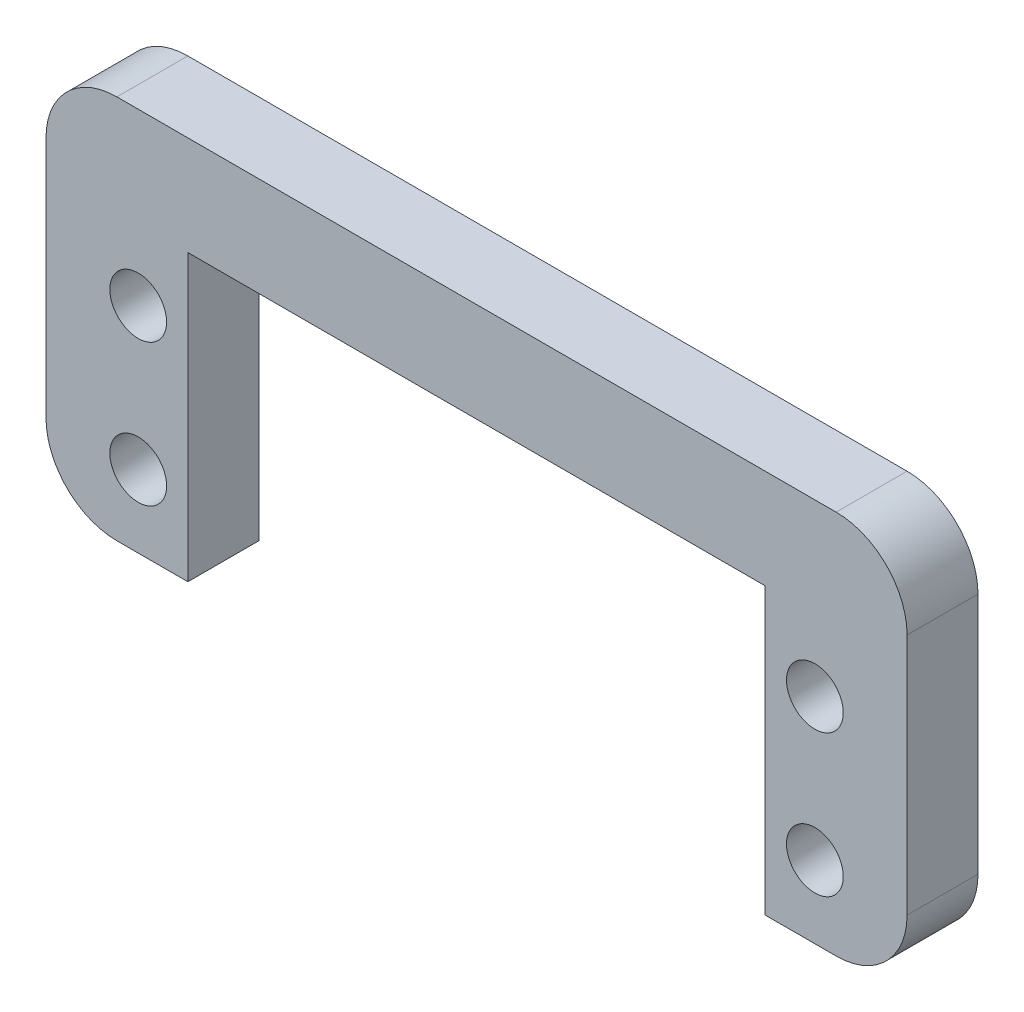
ISO-10303-21;
HEADER;
FILE_DESCRIPTION(('STEP AP214'),'2;1');
FILE_NAME('part.step','',(''),(''),'','','');
FILE_SCHEMA(('AUTOMOTIVE_DESIGN { 1 0 10303 214 1 1 1 1 }'));
ENDSEC;
DATA;
#1=APPLICATION_CONTEXT('core data for automotive mechanical design processes');
#2=APPLICATION_PROTOCOL_DEFINITION('international standard','automotive_design',2000,#1);
#3=PRODUCT_CONTEXT('',#1,'mechanical');
#4=PRODUCT('Part','Part','',(#3));
#5=PRODUCT_RELATED_PRODUCT_CATEGORY('part','',(#4));
#6=PRODUCT_DEFINITION_FORMATION('','',#4);
#7=PRODUCT_DEFINITION_CONTEXT('part definition',#1,'design');
#8=PRODUCT_DEFINITION('design','',#6,#7);
#9=PRODUCT_DEFINITION_SHAPE('','',#8);
#10=(LENGTH_UNIT() NAMED_UNIT(*) SI_UNIT(.MILLI.,.METRE.));
#11=(NAMED_UNIT(*) PLANE_ANGLE_UNIT() SI_UNIT($,.RADIAN.));
#12=(NAMED_UNIT(*) SI_UNIT($,.STERADIAN.) SOLID_ANGLE_UNIT());
#13=UNCERTAINTY_MEASURE_WITH_UNIT(LENGTH_MEASURE(1.E-05),#10,'distance_accuracy_value','');
#14=(GEOMETRIC_REPRESENTATION_CONTEXT(3) GLOBAL_UNCERTAINTY_ASSIGNED_CONTEXT((#13)) GLOBAL_UNIT_ASSIGNED_CONTEXT((#10,
#11,#12)) REPRESENTATION_CONTEXT('',''));
#15=CARTESIAN_POINT('',(0.,0.,0.));
#16=DIRECTION('',(0.,0.,1.));
#17=DIRECTION('',(1.,0.,0.));
#18=AXIS2_PLACEMENT_3D('',#15,#16,#17);
#19=CARTESIAN_POINT('',(25.35,-10.05,-5.));
#20=DIRECTION('',(0.,-1.,0.));
#21=DIRECTION('',(1.,0.,0.));
#22=AXIS2_PLACEMENT_3D('',#19,#20,#21);
#23=PLANE('',#22);
#24=DIRECTION('',(1.,0.,0.));
#25=VECTOR('',#24,1.);
#26=CARTESIAN_POINT('',(25.35,-10.05,0.));
#27=LINE('',#26,#25);
#28=CARTESIAN_POINT('',(20.35,-10.05,0.));
#29=VERTEX_POINT('',#28);
#30=CARTESIAN_POINT('',(25.35,-10.05,0.));
#31=VERTEX_POINT('',#30);
#32=EDGE_CURVE('E172',#29,#31,#27,.T.);
#33=ORIENTED_EDGE('',*,*,#32,.F.);
#34=DIRECTION('',(0.,0.,1.));
#35=VECTOR('',#34,1.);
#36=CARTESIAN_POINT('',(20.35,-10.05,-5.));
#37=LINE('',#36,#35);
#38=CARTESIAN_POINT('',(20.35,-10.05,-5.));
#39=VERTEX_POINT('',#38);
#40=EDGE_CURVE('E11',#39,#29,#37,.T.);
#41=ORIENTED_EDGE('',*,*,#40,.F.);
#42=DIRECTION('',(1.,0.,0.));
#43=VECTOR('',#42,1.);
#44=CARTESIAN_POINT('',(25.35,-10.05,-5.));
#45=LINE('',#44,#43);
#46=CARTESIAN_POINT('',(25.35,-10.05,-5.));
#47=VERTEX_POINT('',#46);
#48=EDGE_CURVE('E217',#39,#47,#45,.T.);
#49=ORIENTED_EDGE('',*,*,#48,.T.);
#50=DIRECTION('',(0.,0.,1.));
#51=VECTOR('',#50,1.);
#52=CARTESIAN_POINT('',(25.35,-10.05,-5.));
#53=LINE('',#52,#51);
#54=EDGE_CURVE('E48',#47,#31,#53,.T.);
#55=ORIENTED_EDGE('',*,*,#54,.T.);
#56=EDGE_LOOP('',(#33,#41,#49,#55));
#57=FACE_BOUND('',#56,.T.);
#58=ADVANCED_FACE('F45',(#57),#23,.T.);
#59=CARTESIAN_POINT('',(20.35,10.05,-5.));
#60=DIRECTION('',(-1.,0.,0.));
#61=DIRECTION('',(0.,-1.,0.));
#62=AXIS2_PLACEMENT_3D('',#59,#60,#61);
#63=PLANE('',#62);
#64=DIRECTION('',(0.,-1.,0.));
#65=VECTOR('',#64,1.);
#66=CARTESIAN_POINT('',(20.35,10.05,0.));
#67=LINE('',#66,#65);
#68=CARTESIAN_POINT('',(20.35,10.05,0.));
#69=VERTEX_POINT('',#68);
#70=EDGE_CURVE('E214',#69,#29,#67,.T.);
#71=ORIENTED_EDGE('',*,*,#70,.F.);
#72=DIRECTION('',(0.,0.,1.));
#73=VECTOR('',#72,1.);
#74=CARTESIAN_POINT('',(20.35,10.05,-5.));
#75=LINE('',#74,#73);
#76=CARTESIAN_POINT('',(20.35,10.05,-5.));
#77=VERTEX_POINT('',#76);
#78=EDGE_CURVE('E55',#77,#69,#75,.T.);
#79=ORIENTED_EDGE('',*,*,#78,.F.);
#80=DIRECTION('',(0.,-1.,0.));
#81=VECTOR('',#80,1.);
#82=CARTESIAN_POINT('',(20.35,10.05,-5.));
#83=LINE('',#82,#81);
#84=EDGE_CURVE('E158',#77,#39,#83,.T.);
#85=ORIENTED_EDGE('',*,*,#84,.T.);
#86=ORIENTED_EDGE('',*,*,#40,.T.);
#87=EDGE_LOOP('',(#71,#79,#85,#86));
#88=FACE_BOUND('',#87,.T.);
#89=ADVANCED_FACE('F247',(#88),#63,.T.);
#90=CARTESIAN_POINT('',(-20.35,10.05,-5.));
#91=DIRECTION('',(0.,-1.,0.));
#92=DIRECTION('',(1.,0.,0.));
#93=AXIS2_PLACEMENT_3D('',#90,#91,#92);
#94=PLANE('',#93);
#95=DIRECTION('',(1.,0.,0.));
#96=VECTOR('',#95,1.);
#97=CARTESIAN_POINT('',(-20.35,10.05,0.));
#98=LINE('',#97,#96);
#99=CARTESIAN_POINT('',(-20.35,10.05,0.));
#100=VERTEX_POINT('',#99);
#101=EDGE_CURVE('E144',#100,#69,#98,.T.);
#102=ORIENTED_EDGE('',*,*,#101,.F.);
#103=DIRECTION('',(0.,0.,1.));
#104=VECTOR('',#103,1.);
#105=CARTESIAN_POINT('',(-20.35,10.05,-5.));
#106=LINE('',#105,#104);
#107=CARTESIAN_POINT('',(-20.35,10.05,-5.));
#108=VERTEX_POINT('',#107);
#109=EDGE_CURVE('E139',#108,#100,#106,.T.);
#110=ORIENTED_EDGE('',*,*,#109,.F.);
#111=DIRECTION('',(1.,0.,0.));
#112=VECTOR('',#111,1.);
#113=CARTESIAN_POINT('',(-20.35,10.05,-5.));
#114=LINE('',#113,#112);
#115=EDGE_CURVE('E142',#108,#77,#114,.T.);
#116=ORIENTED_EDGE('',*,*,#115,.T.);
#117=ORIENTED_EDGE('',*,*,#78,.T.);
#118=EDGE_LOOP('',(#102,#110,#116,#117));
#119=FACE_BOUND('',#118,.T.);
#120=ADVANCED_FACE('F141',(#119),#94,.T.);
#121=CARTESIAN_POINT('',(-20.35,-10.05,-5.));
#122=DIRECTION('',(1.,0.,0.));
#123=DIRECTION('',(0.,1.,0.));
#124=AXIS2_PLACEMENT_3D('',#121,#122,#123);
#125=PLANE('',#124);
#126=DIRECTION('',(0.,1.,0.));
#127=VECTOR('',#126,1.);
#128=CARTESIAN_POINT('',(-20.35,-10.05,0.));
#129=LINE('',#128,#127);
#130=CARTESIAN_POINT('',(-20.35,-10.05,0.));
#131=VERTEX_POINT('',#130);
#132=EDGE_CURVE('E209',#131,#100,#129,.T.);
#133=ORIENTED_EDGE('',*,*,#132,.F.);
#134=DIRECTION('',(0.,0.,1.));
#135=VECTOR('',#134,1.);
#136=CARTESIAN_POINT('',(-20.35,-10.05,-5.));
#137=LINE('',#136,#135);
#138=CARTESIAN_POINT('',(-20.35,-10.05,-5.));
#139=VERTEX_POINT('',#138);
#140=EDGE_CURVE('E150',#139,#131,#137,.T.);
#141=ORIENTED_EDGE('',*,*,#140,.F.);
#142=DIRECTION('',(0.,1.,0.));
#143=VECTOR('',#142,1.);
#144=CARTESIAN_POINT('',(-20.35,-10.05,-5.));
#145=LINE('',#144,#143);
#146=EDGE_CURVE('E156',#139,#108,#145,.T.);
#147=ORIENTED_EDGE('',*,*,#146,.T.);
#148=ORIENTED_EDGE('',*,*,#109,.T.);
#149=EDGE_LOOP('',(#133,#141,#147,#148));
#150=FACE_BOUND('',#149,.T.);
#151=ADVANCED_FACE('F161',(#150),#125,.T.);
#152=CARTESIAN_POINT('',(-25.35,-10.05,-5.));
#153=DIRECTION('',(0.,-1.,0.));
#154=DIRECTION('',(0.,0.,-1.));
#155=AXIS2_PLACEMENT_3D('',#152,#153,#154);
#156=PLANE('',#155);
#157=DIRECTION('',(1.,0.,0.));
#158=VECTOR('',#157,1.);
#159=CARTESIAN_POINT('',(-25.35,-10.05,0.));
#160=LINE('',#159,#158);
#161=CARTESIAN_POINT('',(-25.35,-10.05,0.));
#162=VERTEX_POINT('',#161);
#163=EDGE_CURVE('E205',#162,#131,#160,.T.);
#164=ORIENTED_EDGE('',*,*,#163,.F.);
#165=DIRECTION('',(0.,0.,1.));
#166=VECTOR('',#165,1.);
#167=CARTESIAN_POINT('',(-25.35,-10.05,-5.));
#168=LINE('',#167,#166);
#169=CARTESIAN_POINT('',(-25.35,-10.05,-5.));
#170=VERTEX_POINT('',#169);
#171=EDGE_CURVE('E223',#170,#162,#168,.T.);
#172=ORIENTED_EDGE('',*,*,#171,.F.);
#173=DIRECTION('',(1.,0.,0.));
#174=VECTOR('',#173,1.);
#175=CARTESIAN_POINT('',(-25.35,-10.05,-5.));
#176=LINE('',#175,#174);
#177=EDGE_CURVE('E163',#170,#139,#176,.T.);
#178=ORIENTED_EDGE('',*,*,#177,.T.);
#179=ORIENTED_EDGE('',*,*,#140,.T.);
#180=EDGE_LOOP('',(#164,#172,#178,#179));
#181=FACE_BOUND('',#180,.T.);
#182=ADVANCED_FACE('F260',(#181),#156,.T.);
#183=CARTESIAN_POINT('',(-25.35,-5.05,-5.));
#184=DIRECTION('',(0.,0.,1.));
#185=DIRECTION('',(1.,0.,0.));
#186=AXIS2_PLACEMENT_3D('',#183,#184,#185);
#187=CYLINDRICAL_SURFACE('',#186,5.);
#188=CARTESIAN_POINT('',(-25.35,-5.05,0.));
#189=DIRECTION('',(0.,0.,1.));
#190=DIRECTION('',(1.,0.,0.));
#191=AXIS2_PLACEMENT_3D('',#188,#189,#190);
#192=CIRCLE('',#191,5.);
#193=CARTESIAN_POINT('',(-30.35,-5.04999999999997,0.));
#194=VERTEX_POINT('',#193);
#195=EDGE_CURVE('E201',#194,#162,#192,.T.);
#196=ORIENTED_EDGE('',*,*,#195,.F.);
#197=DIRECTION('',(0.,0.,1.));
#198=VECTOR('',#197,1.);
#199=CARTESIAN_POINT('',(-30.35,-5.04999999999997,-5.));
#200=LINE('',#199,#198);
#201=CARTESIAN_POINT('',(-30.35,-5.04999999999997,-5.));
#202=VERTEX_POINT('',#201);
#203=EDGE_CURVE('E226',#202,#194,#200,.T.);
#204=ORIENTED_EDGE('',*,*,#203,.F.);
#205=CARTESIAN_POINT('',(-25.35,-5.05,-5.));
#206=DIRECTION('',(0.,0.,1.));
#207=DIRECTION('',(1.,0.,0.));
#208=AXIS2_PLACEMENT_3D('',#205,#206,#207);
#209=CIRCLE('',#208,5.);
#210=EDGE_CURVE('E166',#202,#170,#209,.T.);
#211=ORIENTED_EDGE('',*,*,#210,.T.);
#212=ORIENTED_EDGE('',*,*,#171,.T.);
#213=EDGE_LOOP('',(#196,#204,#211,#212));
#214=FACE_BOUND('',#213,.T.);
#215=ADVANCED_FACE('F263',(#214),#187,.T.);
#216=CARTESIAN_POINT('',(-30.35,-5.04999999999997,-5.));
#217=DIRECTION('',(-1.,0.,0.));
#218=DIRECTION('',(0.,0.,1.));
#219=AXIS2_PLACEMENT_3D('',#216,#217,#218);
#220=PLANE('',#219);
#221=DIRECTION('',(0.,-1.,0.));
#222=VECTOR('',#221,1.);
#223=CARTESIAN_POINT('',(-30.35,-5.04999999999997,0.));
#224=LINE('',#223,#222);
#225=CARTESIAN_POINT('',(-30.35,12.05,0.));
#226=VERTEX_POINT('',#225);
#227=EDGE_CURVE('E197',#226,#194,#224,.T.);
#228=ORIENTED_EDGE('',*,*,#227,.F.);
#229=DIRECTION('',(0.,0.,1.));
#230=VECTOR('',#229,1.);
#231=CARTESIAN_POINT('',(-30.35,12.05,-5.));
#232=LINE('',#231,#230);
#233=CARTESIAN_POINT('',(-30.35,12.05,-5.));
#234=VERTEX_POINT('',#233);
#235=EDGE_CURVE('E229',#234,#226,#232,.T.);
#236=ORIENTED_EDGE('',*,*,#235,.F.);
#237=DIRECTION('',(0.,-1.,0.));
#238=VECTOR('',#237,1.);
#239=CARTESIAN_POINT('',(-30.35,-5.04999999999997,-5.));
#240=LINE('',#239,#238);
#241=EDGE_CURVE('E371',#234,#202,#240,.T.);
#242=ORIENTED_EDGE('',*,*,#241,.T.);
#243=ORIENTED_EDGE('',*,*,#203,.T.);
#244=EDGE_LOOP('',(#228,#236,#242,#243));
#245=FACE_BOUND('',#244,.T.);
#246=ADVANCED_FACE('F267',(#245),#220,.T.);
#247=CARTESIAN_POINT('',(-25.35,12.05,-5.));
#248=DIRECTION('',(0.,0.,1.));
#249=DIRECTION('',(1.,0.,0.));
#250=AXIS2_PLACEMENT_3D('',#247,#248,#249);
#251=CYLINDRICAL_SURFACE('',#250,5.);
#252=CARTESIAN_POINT('',(-25.35,12.05,0.));
#253=DIRECTION('',(0.,0.,1.));
#254=DIRECTION('',(-1.,0.,0.));
#255=AXIS2_PLACEMENT_3D('',#252,#253,#254);
#256=CIRCLE('',#255,5.);
#257=CARTESIAN_POINT('',(-25.35,17.05,0.));
#258=VERTEX_POINT('',#257);
#259=EDGE_CURVE('E193',#258,#226,#256,.T.);
#260=ORIENTED_EDGE('',*,*,#259,.F.);
#261=DIRECTION('',(0.,0.,1.));
#262=VECTOR('',#261,1.);
#263=CARTESIAN_POINT('',(-25.35,17.05,-5.));
#264=LINE('',#263,#262);
#265=CARTESIAN_POINT('',(-25.35,17.05,-5.));
#266=VERTEX_POINT('',#265);
#267=EDGE_CURVE('E232',#266,#258,#264,.T.);
#268=ORIENTED_EDGE('',*,*,#267,.F.);
#269=CARTESIAN_POINT('',(-25.35,12.05,-5.));
#270=DIRECTION('',(0.,0.,1.));
#271=DIRECTION('',(-1.,0.,0.));
#272=AXIS2_PLACEMENT_3D('',#269,#270,#271);
#273=CIRCLE('',#272,5.);
#274=EDGE_CURVE('E367',#266,#234,#273,.T.);
#275=ORIENTED_EDGE('',*,*,#274,.T.);
#276=ORIENTED_EDGE('',*,*,#235,.T.);
#277=EDGE_LOOP('',(#260,#268,#275,#276));
#278=FACE_BOUND('',#277,.T.);
#279=ADVANCED_FACE('F271',(#278),#251,.T.);
#280=CARTESIAN_POINT('',(-25.35,17.05,-5.));
#281=DIRECTION('',(0.,1.,0.));
#282=DIRECTION('',(0.,0.,1.));
#283=AXIS2_PLACEMENT_3D('',#280,#281,#282);
#284=PLANE('',#283);
#285=DIRECTION('',(-1.,0.,0.));
#286=VECTOR('',#285,1.);
#287=CARTESIAN_POINT('',(-25.35,17.05,0.));
#288=LINE('',#287,#286);
#289=CARTESIAN_POINT('',(25.35,17.05,0.));
#290=VERTEX_POINT('',#289);
#291=EDGE_CURVE('E189',#290,#258,#288,.T.);
#292=ORIENTED_EDGE('',*,*,#291,.F.);
#293=DIRECTION('',(0.,0.,1.));
#294=VECTOR('',#293,1.);
#295=CARTESIAN_POINT('',(25.35,17.05,-5.));
#296=LINE('',#295,#294);
#297=CARTESIAN_POINT('',(25.35,17.05,-5.));
#298=VERTEX_POINT('',#297);
#299=EDGE_CURVE('E235',#298,#290,#296,.T.);
#300=ORIENTED_EDGE('',*,*,#299,.F.);
#301=DIRECTION('',(-1.,0.,0.));
#302=VECTOR('',#301,1.);
#303=CARTESIAN_POINT('',(-25.35,17.05,-5.));
#304=LINE('',#303,#302);
#305=EDGE_CURVE('E363',#298,#266,#304,.T.);
#306=ORIENTED_EDGE('',*,*,#305,.T.);
#307=ORIENTED_EDGE('',*,*,#267,.T.);
#308=EDGE_LOOP('',(#292,#300,#306,#307));
#309=FACE_BOUND('',#308,.T.);
#310=ADVANCED_FACE('F275',(#309),#284,.T.);
#311=CARTESIAN_POINT('',(25.35,12.05,-5.));
#312=DIRECTION('',(0.,0.,1.));
#313=DIRECTION('',(1.,0.,0.));
#314=AXIS2_PLACEMENT_3D('',#311,#312,#313);
#315=CYLINDRICAL_SURFACE('',#314,5.);
#316=CARTESIAN_POINT('',(25.35,12.05,0.));
#317=DIRECTION('',(0.,0.,1.));
#318=DIRECTION('',(1.,0.,0.));
#319=AXIS2_PLACEMENT_3D('',#316,#317,#318);
#320=CIRCLE('',#319,5.);
#321=CARTESIAN_POINT('',(30.35,12.05,0.));
#322=VERTEX_POINT('',#321);
#323=EDGE_CURVE('E185',#322,#290,#320,.T.);
#324=ORIENTED_EDGE('',*,*,#323,.F.);
#325=DIRECTION('',(0.,0.,1.));
#326=VECTOR('',#325,1.);
#327=CARTESIAN_POINT('',(30.35,12.05,-5.));
#328=LINE('',#327,#326);
#329=CARTESIAN_POINT('',(30.35,12.05,-5.));
#330=VERTEX_POINT('',#329);
#331=EDGE_CURVE('E238',#330,#322,#328,.T.);
#332=ORIENTED_EDGE('',*,*,#331,.F.);
#333=CARTESIAN_POINT('',(25.35,12.05,-5.));
#334=DIRECTION('',(0.,0.,1.));
#335=DIRECTION('',(1.,0.,0.));
#336=AXIS2_PLACEMENT_3D('',#333,#334,#335);
#337=CIRCLE('',#336,5.);
#338=EDGE_CURVE('E359',#330,#298,#337,.T.);
#339=ORIENTED_EDGE('',*,*,#338,.T.);
#340=ORIENTED_EDGE('',*,*,#299,.T.);
#341=EDGE_LOOP('',(#324,#332,#339,#340));
#342=FACE_BOUND('',#341,.T.);
#343=ADVANCED_FACE('F279',(#342),#315,.T.);
#344=CARTESIAN_POINT('',(30.35,-5.04999999999997,-5.));
#345=DIRECTION('',(1.,0.,0.));
#346=DIRECTION('',(0.,0.,-1.));
#347=AXIS2_PLACEMENT_3D('',#344,#345,#346);
#348=PLANE('',#347);
#349=DIRECTION('',(0.,1.,0.));
#350=VECTOR('',#349,1.);
#351=CARTESIAN_POINT('',(30.35,-5.04999999999997,0.));
#352=LINE('',#351,#350);
#353=CARTESIAN_POINT('',(30.35,-5.04999999999997,0.));
#354=VERTEX_POINT('',#353);
#355=EDGE_CURVE('E181',#354,#322,#352,.T.);
#356=ORIENTED_EDGE('',*,*,#355,.F.);
#357=DIRECTION('',(0.,0.,1.));
#358=VECTOR('',#357,1.);
#359=CARTESIAN_POINT('',(30.35,-5.04999999999997,-5.));
#360=LINE('',#359,#358);
#361=CARTESIAN_POINT('',(30.35,-5.04999999999997,-5.));
#362=VERTEX_POINT('',#361);
#363=EDGE_CURVE('E240',#362,#354,#360,.T.);
#364=ORIENTED_EDGE('',*,*,#363,.F.);
#365=DIRECTION('',(0.,1.,0.));
#366=VECTOR('',#365,1.);
#367=CARTESIAN_POINT('',(30.35,-5.04999999999997,-5.));
#368=LINE('',#367,#366);
#369=EDGE_CURVE('E355',#362,#330,#368,.T.);
#370=ORIENTED_EDGE('',*,*,#369,.T.);
#371=ORIENTED_EDGE('',*,*,#331,.T.);
#372=EDGE_LOOP('',(#356,#364,#370,#371));
#373=FACE_BOUND('',#372,.T.);
#374=ADVANCED_FACE('F283',(#373),#348,.T.);
#375=CARTESIAN_POINT('',(25.35,-5.05,-5.));
#376=DIRECTION('',(0.,0.,1.));
#377=DIRECTION('',(1.,0.,0.));
#378=AXIS2_PLACEMENT_3D('',#375,#376,#377);
#379=CYLINDRICAL_SURFACE('',#378,5.);
#380=CARTESIAN_POINT('',(25.35,-5.05,0.));
#381=DIRECTION('',(0.,0.,1.));
#382=DIRECTION('',(-1.,0.,0.));
#383=AXIS2_PLACEMENT_3D('',#380,#381,#382);
#384=CIRCLE('',#383,5.);
#385=EDGE_CURVE('E176',#31,#354,#384,.T.);
#386=ORIENTED_EDGE('',*,*,#385,.F.);
#387=ORIENTED_EDGE('',*,*,#54,.F.);
#388=CARTESIAN_POINT('',(25.35,-5.05,-5.));
#389=DIRECTION('',(0.,0.,1.));
#390=DIRECTION('',(-1.,0.,0.));
#391=AXIS2_PLACEMENT_3D('',#388,#389,#390);
#392=CIRCLE('',#391,5.);
#393=EDGE_CURVE('E352',#47,#362,#392,.T.);
#394=ORIENTED_EDGE('',*,*,#393,.T.);
#395=ORIENTED_EDGE('',*,*,#363,.T.);
#396=EDGE_LOOP('',(#386,#387,#394,#395));
#397=FACE_BOUND('',#396,.T.);
#398=ADVANCED_FACE('F244',(#397),#379,.T.);
#399=CARTESIAN_POINT('',(-25.35,-5.05,-5.));
#400=DIRECTION('',(0.,0.,1.));
#401=DIRECTION('',(1.,0.,0.));
#402=AXIS2_PLACEMENT_3D('',#399,#400,#401);
#403=PLANE('',#402);
#404=CARTESIAN_POINT('',(23.85,-4.95,-5.));
#405=DIRECTION('',(0.,0.,1.));
#406=DIRECTION('',(-1.,0.,0.));
#407=AXIS2_PLACEMENT_3D('',#404,#405,#406);
#408=CIRCLE('',#407,2.);
#409=CARTESIAN_POINT('',(21.85,-4.95,-5.));
#410=VERTEX_POINT('',#409);
#411=EDGE_CURVE('E318',#410,#410,#408,.T.);
#412=ORIENTED_EDGE('',*,*,#411,.T.);
#413=EDGE_LOOP('',(#412));
#414=FACE_BOUND('',#413,.T.);
#415=CARTESIAN_POINT('',(23.85,5.05,-5.));
#416=DIRECTION('',(0.,0.,1.));
#417=DIRECTION('',(-1.,0.,0.));
#418=AXIS2_PLACEMENT_3D('',#415,#416,#417);
#419=CIRCLE('',#418,2.);
#420=CARTESIAN_POINT('',(21.85,5.05,-5.));
#421=VERTEX_POINT('',#420);
#422=EDGE_CURVE('E328',#421,#421,#419,.T.);
#423=ORIENTED_EDGE('',*,*,#422,.T.);
#424=EDGE_LOOP('',(#423));
#425=FACE_BOUND('',#424,.T.);
#426=CARTESIAN_POINT('',(-23.85,-4.95,-5.));
#427=DIRECTION('',(0.,0.,1.));
#428=DIRECTION('',(1.,0.,0.));
#429=AXIS2_PLACEMENT_3D('',#426,#427,#428);
#430=CIRCLE('',#429,2.);
#431=CARTESIAN_POINT('',(-21.85,-4.95,-5.));
#432=VERTEX_POINT('',#431);
#433=EDGE_CURVE('E336',#432,#432,#430,.T.);
#434=ORIENTED_EDGE('',*,*,#433,.T.);
#435=EDGE_LOOP('',(#434));
#436=FACE_BOUND('',#435,.T.);
#437=CARTESIAN_POINT('',(-23.85,5.05,-5.));
#438=DIRECTION('',(0.,0.,1.));
#439=DIRECTION('',(1.,0.,0.));
#440=AXIS2_PLACEMENT_3D('',#437,#438,#439);
#441=CIRCLE('',#440,2.);
#442=CARTESIAN_POINT('',(-21.85,5.05,-5.));
#443=VERTEX_POINT('',#442);
#444=EDGE_CURVE('E177',#443,#443,#441,.T.);
#445=ORIENTED_EDGE('',*,*,#444,.T.);
#446=EDGE_LOOP('',(#445));
#447=FACE_BOUND('',#446,.T.);
#448=ORIENTED_EDGE('',*,*,#48,.F.);
#449=ORIENTED_EDGE('',*,*,#84,.F.);
#450=ORIENTED_EDGE('',*,*,#115,.F.);
#451=ORIENTED_EDGE('',*,*,#146,.F.);
#452=ORIENTED_EDGE('',*,*,#177,.F.);
#453=ORIENTED_EDGE('',*,*,#210,.F.);
#454=ORIENTED_EDGE('',*,*,#241,.F.);
#455=ORIENTED_EDGE('',*,*,#274,.F.);
#456=ORIENTED_EDGE('',*,*,#305,.F.);
#457=ORIENTED_EDGE('',*,*,#338,.F.);
#458=ORIENTED_EDGE('',*,*,#369,.F.);
#459=ORIENTED_EDGE('',*,*,#393,.F.);
#460=EDGE_LOOP('',(#448,#449,#450,#451,#452,#453,#454,#455,#456,#457,#458,#459));
#461=FACE_BOUND('',#460,.T.);
#462=ADVANCED_FACE('F154',(#414,#425,#436,#447,#461),#403,.F.);
#463=CARTESIAN_POINT('',(-25.35,-5.05,0.));
#464=DIRECTION('',(0.,0.,1.));
#465=DIRECTION('',(1.,0.,0.));
#466=AXIS2_PLACEMENT_3D('',#463,#464,#465);
#467=PLANE('',#466);
#468=CARTESIAN_POINT('',(23.85,-4.95,0.));
#469=DIRECTION('',(0.,0.,1.));
#470=DIRECTION('',(-1.,0.,0.));
#471=AXIS2_PLACEMENT_3D('',#468,#469,#470);
#472=CIRCLE('',#471,2.);
#473=CARTESIAN_POINT('',(21.85,-4.95,0.));
#474=VERTEX_POINT('',#473);
#475=EDGE_CURVE('E321',#474,#474,#472,.T.);
#476=ORIENTED_EDGE('',*,*,#475,.F.);
#477=EDGE_LOOP('',(#476));
#478=FACE_BOUND('',#477,.T.);
#479=CARTESIAN_POINT('',(23.85,5.05,0.));
#480=DIRECTION('',(0.,0.,1.));
#481=DIRECTION('',(-1.,0.,0.));
#482=AXIS2_PLACEMENT_3D('',#479,#480,#481);
#483=CIRCLE('',#482,2.);
#484=CARTESIAN_POINT('',(21.85,5.05,0.));
#485=VERTEX_POINT('',#484);
#486=EDGE_CURVE('E325',#485,#485,#483,.T.);
#487=ORIENTED_EDGE('',*,*,#486,.F.);
#488=EDGE_LOOP('',(#487));
#489=FACE_BOUND('',#488,.T.);
#490=CARTESIAN_POINT('',(-23.85,-4.95,0.));
#491=DIRECTION('',(0.,0.,1.));
#492=DIRECTION('',(1.,0.,0.));
#493=AXIS2_PLACEMENT_3D('',#490,#491,#492);
#494=CIRCLE('',#493,2.);
#495=CARTESIAN_POINT('',(-21.85,-4.95,0.));
#496=VERTEX_POINT('',#495);
#497=EDGE_CURVE('E332',#496,#496,#494,.T.);
#498=ORIENTED_EDGE('',*,*,#497,.F.);
#499=EDGE_LOOP('',(#498));
#500=FACE_BOUND('',#499,.T.);
#501=CARTESIAN_POINT('',(-23.85,5.05,0.));
#502=DIRECTION('',(0.,0.,1.));
#503=DIRECTION('',(1.,0.,0.));
#504=AXIS2_PLACEMENT_3D('',#501,#502,#503);
#505=CIRCLE('',#504,2.);
#506=CARTESIAN_POINT('',(-21.85,5.05,0.));
#507=VERTEX_POINT('',#506);
#508=EDGE_CURVE('E340',#507,#507,#505,.T.);
#509=ORIENTED_EDGE('',*,*,#508,.F.);
#510=EDGE_LOOP('',(#509));
#511=FACE_BOUND('',#510,.T.);
#512=ORIENTED_EDGE('',*,*,#32,.T.);
#513=ORIENTED_EDGE('',*,*,#385,.T.);
#514=ORIENTED_EDGE('',*,*,#355,.T.);
#515=ORIENTED_EDGE('',*,*,#323,.T.);
#516=ORIENTED_EDGE('',*,*,#291,.T.);
#517=ORIENTED_EDGE('',*,*,#259,.T.);
#518=ORIENTED_EDGE('',*,*,#227,.T.);
#519=ORIENTED_EDGE('',*,*,#195,.T.);
#520=ORIENTED_EDGE('',*,*,#163,.T.);
#521=ORIENTED_EDGE('',*,*,#132,.T.);
#522=ORIENTED_EDGE('',*,*,#101,.T.);
#523=ORIENTED_EDGE('',*,*,#70,.T.);
#524=EDGE_LOOP('',(#512,#513,#514,#515,#516,#517,#518,#519,#520,#521,#522,#523));
#525=FACE_BOUND('',#524,.T.);
#526=ADVANCED_FACE('F246',(#478,#489,#500,#511,#525),#467,.T.);
#527=CARTESIAN_POINT('',(-23.85,5.05,-5.));
#528=DIRECTION('',(0.,0.,1.));
#529=DIRECTION('',(1.,0.,0.));
#530=AXIS2_PLACEMENT_3D('',#527,#528,#529);
#531=CYLINDRICAL_SURFACE('',#530,2.);
#532=ORIENTED_EDGE('',*,*,#444,.F.);
#533=EDGE_LOOP('',(#532));
#534=FACE_BOUND('',#533,.T.);
#535=ORIENTED_EDGE('',*,*,#508,.T.);
#536=EDGE_LOOP('',(#535));
#537=FACE_BOUND('',#536,.T.);
#538=ADVANCED_FACE('F295',(#534,#537),#531,.F.);
#539=CARTESIAN_POINT('',(-23.85,-4.95,-5.));
#540=DIRECTION('',(0.,0.,1.));
#541=DIRECTION('',(1.,0.,0.));
#542=AXIS2_PLACEMENT_3D('',#539,#540,#541);
#543=CYLINDRICAL_SURFACE('',#542,2.);
#544=ORIENTED_EDGE('',*,*,#433,.F.);
#545=EDGE_LOOP('',(#544));
#546=FACE_BOUND('',#545,.T.);
#547=ORIENTED_EDGE('',*,*,#497,.T.);
#548=EDGE_LOOP('',(#547));
#549=FACE_BOUND('',#548,.T.);
#550=ADVANCED_FACE('F302',(#546,#549),#543,.F.);
#551=CARTESIAN_POINT('',(23.85,5.05,-5.));
#552=DIRECTION('',(0.,0.,1.));
#553=DIRECTION('',(1.,0.,0.));
#554=AXIS2_PLACEMENT_3D('',#551,#552,#553);
#555=CYLINDRICAL_SURFACE('',#554,2.);
#556=ORIENTED_EDGE('',*,*,#422,.F.);
#557=EDGE_LOOP('',(#556));
#558=FACE_BOUND('',#557,.T.);
#559=ORIENTED_EDGE('',*,*,#486,.T.);
#560=EDGE_LOOP('',(#559));
#561=FACE_BOUND('',#560,.T.);
#562=ADVANCED_FACE('F306',(#558,#561),#555,.F.);
#563=CARTESIAN_POINT('',(23.85,-4.95,-5.));
#564=DIRECTION('',(0.,0.,1.));
#565=DIRECTION('',(1.,0.,0.));
#566=AXIS2_PLACEMENT_3D('',#563,#564,#565);
#567=CYLINDRICAL_SURFACE('',#566,2.);
#568=ORIENTED_EDGE('',*,*,#411,.F.);
#569=EDGE_LOOP('',(#568));
#570=FACE_BOUND('',#569,.T.);
#571=ORIENTED_EDGE('',*,*,#475,.T.);
#572=EDGE_LOOP('',(#571));
#573=FACE_BOUND('',#572,.T.);
#574=ADVANCED_FACE('F310',(#570,#573),#567,.F.);
#575=CLOSED_SHELL('',(#58,#89,#120,#151,#182,#215,#246,#279,#310,#343,#374,#398,#462,#526,#538,
#550,#562,#574));
#576=MANIFOLD_SOLID_BREP('B2',#575);
#577=ADVANCED_BREP_SHAPE_REPRESENTATION('',(#18,#576),#14);
#578=SHAPE_DEFINITION_REPRESENTATION(#9,#577);
ENDSEC;
END-ISO-10303-21;
